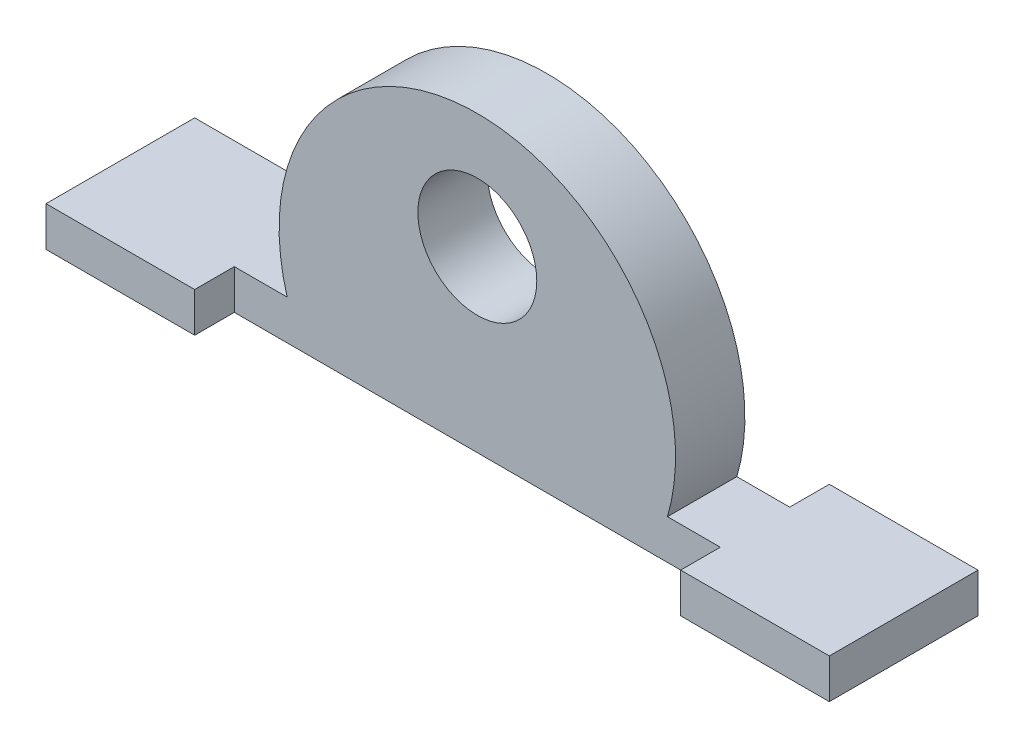
ISO-10303-21;
HEADER;
FILE_DESCRIPTION(('STEP AP214'),'2;1');
FILE_NAME('part.step','',(''),(''),'','','');
FILE_SCHEMA(('AUTOMOTIVE_DESIGN { 1 0 10303 214 1 1 1 1 }'));
ENDSEC;
DATA;
#1=APPLICATION_CONTEXT('core data for automotive mechanical design processes');
#2=APPLICATION_PROTOCOL_DEFINITION('international standard','automotive_design',2000,#1);
#3=PRODUCT_CONTEXT('',#1,'mechanical');
#4=PRODUCT('Part','Part','',(#3));
#5=PRODUCT_RELATED_PRODUCT_CATEGORY('part','',(#4));
#6=PRODUCT_DEFINITION_FORMATION('','',#4);
#7=PRODUCT_DEFINITION_CONTEXT('part definition',#1,'design');
#8=PRODUCT_DEFINITION('design','',#6,#7);
#9=PRODUCT_DEFINITION_SHAPE('','',#8);
#10=(LENGTH_UNIT() NAMED_UNIT(*) SI_UNIT(.MILLI.,.METRE.));
#11=(NAMED_UNIT(*) PLANE_ANGLE_UNIT() SI_UNIT($,.RADIAN.));
#12=(NAMED_UNIT(*) SI_UNIT($,.STERADIAN.) SOLID_ANGLE_UNIT());
#13=UNCERTAINTY_MEASURE_WITH_UNIT(LENGTH_MEASURE(1.E-05),#10,'distance_accuracy_value','');
#14=(GEOMETRIC_REPRESENTATION_CONTEXT(3) GLOBAL_UNCERTAINTY_ASSIGNED_CONTEXT((#13)) GLOBAL_UNIT_ASSIGNED_CONTEXT((#10,
#11,#12)) REPRESENTATION_CONTEXT('',''));
#15=CARTESIAN_POINT('',(0.,0.,0.));
#16=DIRECTION('',(0.,0.,1.));
#17=DIRECTION('',(1.,0.,0.));
#18=AXIS2_PLACEMENT_3D('',#15,#16,#17);
#19=CARTESIAN_POINT('',(0.,0.,7.));
#20=DIRECTION('',(0.,0.,1.));
#21=DIRECTION('',(1.,0.,0.));
#22=AXIS2_PLACEMENT_3D('',#19,#20,#21);
#23=PLANE('',#22);
#24=DIRECTION('',(1.,0.,0.));
#25=VECTOR('',#24,1.);
#26=CARTESIAN_POINT('',(17.5178370985048,-9.65014939730209,7.));
#27=LINE('',#26,#25);
#28=CARTESIAN_POINT('',(-24.5178370985048,-9.65014939730209,7.));
#29=VERTEX_POINT('',#28);
#30=CARTESIAN_POINT('',(24.5178370985048,-9.65014939730209,7.));
#31=VERTEX_POINT('',#30);
#32=EDGE_CURVE('E253',#29,#31,#27,.T.);
#33=ORIENTED_EDGE('',*,*,#32,.T.);
#34=DIRECTION('',(0.,-1.,0.));
#35=VECTOR('',#34,1.);
#36=CARTESIAN_POINT('',(24.5178370985048,-5.65014939730209,7.));
#37=LINE('',#36,#35);
#38=CARTESIAN_POINT('',(24.5178370985048,-5.65014939730209,7.));
#39=VERTEX_POINT('',#38);
#40=EDGE_CURVE('E208',#39,#31,#37,.T.);
#41=ORIENTED_EDGE('',*,*,#40,.F.);
#42=DIRECTION('',(-1.,0.,0.));
#43=VECTOR('',#42,1.);
#44=CARTESIAN_POINT('',(17.5178370985048,-5.65014939730209,7.));
#45=LINE('',#44,#43);
#46=CARTESIAN_POINT('',(19.1853019728168,-5.65014939730209,7.));
#47=VERTEX_POINT('',#46);
#48=EDGE_CURVE('E230',#39,#47,#45,.T.);
#49=ORIENTED_EDGE('',*,*,#48,.T.);
#50=CARTESIAN_POINT('',(0.,0.,7.));
#51=DIRECTION('',(0.,0.,1.));
#52=DIRECTION('',(1.,0.,0.));
#53=AXIS2_PLACEMENT_3D('',#50,#51,#52);
#54=CIRCLE('',#53,20.);
#55=CARTESIAN_POINT('',(-19.1853019728168,-5.65014939730209,7.));
#56=VERTEX_POINT('',#55);
#57=EDGE_CURVE('E53',#47,#56,#54,.T.);
#58=ORIENTED_EDGE('',*,*,#57,.T.);
#59=DIRECTION('',(-1.,0.,0.));
#60=VECTOR('',#59,1.);
#61=CARTESIAN_POINT('',(-17.5178370985048,-5.65014939730209,7.));
#62=LINE('',#61,#60);
#63=CARTESIAN_POINT('',(-24.5178370985048,-5.65014939730209,7.));
#64=VERTEX_POINT('',#63);
#65=EDGE_CURVE('E137',#56,#64,#62,.T.);
#66=ORIENTED_EDGE('',*,*,#65,.T.);
#67=DIRECTION('',(0.,-1.,0.));
#68=VECTOR('',#67,1.);
#69=CARTESIAN_POINT('',(-24.5178370985048,-5.65014939730209,7.));
#70=LINE('',#69,#68);
#71=EDGE_CURVE('E140',#64,#29,#70,.T.);
#72=ORIENTED_EDGE('',*,*,#71,.T.);
#73=EDGE_LOOP('',(#33,#41,#49,#58,#66,#72));
#74=FACE_BOUND('',#73,.T.);
#75=CARTESIAN_POINT('',(0.,8.34985060269791,7.));
#76=DIRECTION('',(0.,0.,1.));
#77=DIRECTION('',(1.,0.,0.));
#78=AXIS2_PLACEMENT_3D('',#75,#76,#77);
#79=CIRCLE('',#78,6.);
#80=CARTESIAN_POINT('',(6.,8.34985060269791,7.));
#81=VERTEX_POINT('',#80);
#82=EDGE_CURVE('E246',#81,#81,#79,.T.);
#83=ORIENTED_EDGE('',*,*,#82,.F.);
#84=EDGE_LOOP('',(#83));
#85=FACE_BOUND('',#84,.T.);
#86=ADVANCED_FACE('F39',(#74,#85),#23,.T.);
#87=CARTESIAN_POINT('',(0.,0.,0.));
#88=DIRECTION('',(0.,0.,1.));
#89=DIRECTION('',(1.,0.,0.));
#90=AXIS2_PLACEMENT_3D('',#87,#88,#89);
#91=PLANE('',#90);
#92=DIRECTION('',(0.,-1.,0.));
#93=VECTOR('',#92,1.);
#94=CARTESIAN_POINT('',(24.5178370985048,-5.65014939730209,0.));
#95=LINE('',#94,#93);
#96=CARTESIAN_POINT('',(24.5178370985048,-5.65014939730209,0.));
#97=VERTEX_POINT('',#96);
#98=CARTESIAN_POINT('',(24.5178370985048,-9.65014939730209,0.));
#99=VERTEX_POINT('',#98);
#100=EDGE_CURVE('E211',#97,#99,#95,.T.);
#101=ORIENTED_EDGE('',*,*,#100,.T.);
#102=DIRECTION('',(1.,0.,0.));
#103=VECTOR('',#102,1.);
#104=CARTESIAN_POINT('',(17.5178370985048,-9.65014939730209,0.));
#105=LINE('',#104,#103);
#106=CARTESIAN_POINT('',(-24.5178370985048,-9.65014939730209,0.));
#107=VERTEX_POINT('',#106);
#108=EDGE_CURVE('E254',#107,#99,#105,.T.);
#109=ORIENTED_EDGE('',*,*,#108,.F.);
#110=DIRECTION('',(0.,-1.,0.));
#111=VECTOR('',#110,1.);
#112=CARTESIAN_POINT('',(-24.5178370985048,-5.65014939730209,0.));
#113=LINE('',#112,#111);
#114=CARTESIAN_POINT('',(-24.5178370985048,-5.65014939730209,0.));
#115=VERTEX_POINT('',#114);
#116=EDGE_CURVE('E188',#115,#107,#113,.T.);
#117=ORIENTED_EDGE('',*,*,#116,.F.);
#118=DIRECTION('',(1.,0.,0.));
#119=VECTOR('',#118,1.);
#120=CARTESIAN_POINT('',(-17.5178370985048,-5.65014939730209,0.));
#121=LINE('',#120,#119);
#122=CARTESIAN_POINT('',(-19.1853019728168,-5.65014939730209,0.));
#123=VERTEX_POINT('',#122);
#124=EDGE_CURVE('E154',#115,#123,#121,.T.);
#125=ORIENTED_EDGE('',*,*,#124,.T.);
#126=CARTESIAN_POINT('',(0.,0.,0.));
#127=DIRECTION('',(0.,0.,1.));
#128=DIRECTION('',(1.,0.,0.));
#129=AXIS2_PLACEMENT_3D('',#126,#127,#128);
#130=CIRCLE('',#129,20.);
#131=CARTESIAN_POINT('',(19.1853019728168,-5.65014939730209,0.));
#132=VERTEX_POINT('',#131);
#133=EDGE_CURVE('E249',#132,#123,#130,.T.);
#134=ORIENTED_EDGE('',*,*,#133,.F.);
#135=DIRECTION('',(1.,0.,0.));
#136=VECTOR('',#135,1.);
#137=CARTESIAN_POINT('',(17.5178370985048,-5.65014939730209,0.));
#138=LINE('',#137,#136);
#139=EDGE_CURVE('E201',#132,#97,#138,.T.);
#140=ORIENTED_EDGE('',*,*,#139,.T.);
#141=EDGE_LOOP('',(#101,#109,#117,#125,#134,#140));
#142=FACE_BOUND('',#141,.T.);
#143=CARTESIAN_POINT('',(0.,8.34985060269791,0.));
#144=DIRECTION('',(0.,0.,1.));
#145=DIRECTION('',(1.,0.,0.));
#146=AXIS2_PLACEMENT_3D('',#143,#144,#145);
#147=CIRCLE('',#146,6.);
#148=CARTESIAN_POINT('',(6.,8.34985060269791,0.));
#149=VERTEX_POINT('',#148);
#150=EDGE_CURVE('E191',#149,#149,#147,.T.);
#151=ORIENTED_EDGE('',*,*,#150,.T.);
#152=EDGE_LOOP('',(#151));
#153=FACE_BOUND('',#152,.T.);
#154=ADVANCED_FACE('F263',(#142,#153),#91,.F.);
#155=CARTESIAN_POINT('',(0.,0.,7.));
#156=DIRECTION('',(0.,0.,-1.));
#157=DIRECTION('',(-1.,0.,0.));
#158=AXIS2_PLACEMENT_3D('',#155,#156,#157);
#159=CYLINDRICAL_SURFACE('',#158,20.);
#160=ORIENTED_EDGE('',*,*,#133,.T.);
#161=DIRECTION('',(0.,0.,-1.));
#162=VECTOR('',#161,1.);
#163=CARTESIAN_POINT('',(-19.1853019728168,-5.65014939730209,7.));
#164=LINE('',#163,#162);
#165=EDGE_CURVE('E11',#123,#56,#164,.F.);
#166=ORIENTED_EDGE('',*,*,#165,.T.);
#167=ORIENTED_EDGE('',*,*,#57,.F.);
#168=DIRECTION('',(0.,0.,-1.));
#169=VECTOR('',#168,1.);
#170=CARTESIAN_POINT('',(19.1853019728168,-5.65014939730209,7.));
#171=LINE('',#170,#169);
#172=EDGE_CURVE('E47',#47,#132,#171,.T.);
#173=ORIENTED_EDGE('',*,*,#172,.T.);
#174=EDGE_LOOP('',(#160,#166,#167,#173));
#175=FACE_BOUND('',#174,.T.);
#176=ADVANCED_FACE('F41',(#175),#159,.T.);
#177=CARTESIAN_POINT('',(17.5178370985048,-9.65014939730209,7.));
#178=DIRECTION('',(0.,1.,0.));
#179=DIRECTION('',(0.,0.,1.));
#180=AXIS2_PLACEMENT_3D('',#177,#178,#179);
#181=PLANE('',#180);
#182=ORIENTED_EDGE('',*,*,#108,.T.);
#183=DIRECTION('',(0.,0.,-1.));
#184=VECTOR('',#183,1.);
#185=CARTESIAN_POINT('',(24.5178370985048,-9.65014939730209,-4.));
#186=LINE('',#185,#184);
#187=CARTESIAN_POINT('',(24.5178370985048,-9.65014939730209,-4.));
#188=VERTEX_POINT('',#187);
#189=EDGE_CURVE('E177',#99,#188,#186,.T.);
#190=ORIENTED_EDGE('',*,*,#189,.T.);
#191=DIRECTION('',(1.,0.,0.));
#192=VECTOR('',#191,1.);
#193=CARTESIAN_POINT('',(24.5178370985048,-9.65014939730209,-4.));
#194=LINE('',#193,#192);
#195=CARTESIAN_POINT('',(39.5178370985048,-9.65014939730209,-4.));
#196=VERTEX_POINT('',#195);
#197=EDGE_CURVE('E224',#188,#196,#194,.T.);
#198=ORIENTED_EDGE('',*,*,#197,.T.);
#199=DIRECTION('',(0.,0.,1.));
#200=VECTOR('',#199,1.);
#201=CARTESIAN_POINT('',(39.5178370985048,-9.65014939730209,11.));
#202=LINE('',#201,#200);
#203=CARTESIAN_POINT('',(39.5178370985048,-9.65014939730209,11.));
#204=VERTEX_POINT('',#203);
#205=EDGE_CURVE('E221',#196,#204,#202,.T.);
#206=ORIENTED_EDGE('',*,*,#205,.T.);
#207=DIRECTION('',(-1.,0.,0.));
#208=VECTOR('',#207,1.);
#209=CARTESIAN_POINT('',(24.5178370985048,-9.65014939730209,11.));
#210=LINE('',#209,#208);
#211=CARTESIAN_POINT('',(24.5178370985048,-9.65014939730209,11.));
#212=VERTEX_POINT('',#211);
#213=EDGE_CURVE('E217',#204,#212,#210,.T.);
#214=ORIENTED_EDGE('',*,*,#213,.T.);
#215=DIRECTION('',(0.,0.,-1.));
#216=VECTOR('',#215,1.);
#217=CARTESIAN_POINT('',(24.5178370985048,-9.65014939730209,7.));
#218=LINE('',#217,#216);
#219=EDGE_CURVE('E214',#212,#31,#218,.T.);
#220=ORIENTED_EDGE('',*,*,#219,.T.);
#221=ORIENTED_EDGE('',*,*,#32,.F.);
#222=DIRECTION('',(0.,0.,1.));
#223=VECTOR('',#222,1.);
#224=CARTESIAN_POINT('',(-24.5178370985048,-9.65014939730209,7.));
#225=LINE('',#224,#223);
#226=CARTESIAN_POINT('',(-24.5178370985048,-9.65014939730209,11.));
#227=VERTEX_POINT('',#226);
#228=EDGE_CURVE('E152',#29,#227,#225,.T.);
#229=ORIENTED_EDGE('',*,*,#228,.T.);
#230=DIRECTION('',(-1.,0.,0.));
#231=VECTOR('',#230,1.);
#232=CARTESIAN_POINT('',(-24.5178370985048,-9.65014939730209,11.));
#233=LINE('',#232,#231);
#234=CARTESIAN_POINT('',(-39.5178370985048,-9.65014939730209,11.));
#235=VERTEX_POINT('',#234);
#236=EDGE_CURVE('E176',#227,#235,#233,.T.);
#237=ORIENTED_EDGE('',*,*,#236,.T.);
#238=DIRECTION('',(0.,0.,-1.));
#239=VECTOR('',#238,1.);
#240=CARTESIAN_POINT('',(-39.5178370985048,-9.65014939730209,11.));
#241=LINE('',#240,#239);
#242=CARTESIAN_POINT('',(-39.5178370985048,-9.65014939730209,-4.));
#243=VERTEX_POINT('',#242);
#244=EDGE_CURVE('E180',#235,#243,#241,.T.);
#245=ORIENTED_EDGE('',*,*,#244,.T.);
#246=DIRECTION('',(1.,0.,0.));
#247=VECTOR('',#246,1.);
#248=CARTESIAN_POINT('',(-24.5178370985048,-9.65014939730209,-4.));
#249=LINE('',#248,#247);
#250=CARTESIAN_POINT('',(-24.5178370985048,-9.65014939730209,-4.));
#251=VERTEX_POINT('',#250);
#252=EDGE_CURVE('E183',#243,#251,#249,.T.);
#253=ORIENTED_EDGE('',*,*,#252,.T.);
#254=DIRECTION('',(0.,0.,1.));
#255=VECTOR('',#254,1.);
#256=CARTESIAN_POINT('',(-24.5178370985048,-9.65014939730209,-4.));
#257=LINE('',#256,#255);
#258=EDGE_CURVE('E146',#251,#107,#257,.T.);
#259=ORIENTED_EDGE('',*,*,#258,.T.);
#260=EDGE_LOOP('',(#182,#190,#198,#206,#214,#220,#221,#229,#237,#245,#253,#259));
#261=FACE_BOUND('',#260,.T.);
#262=ADVANCED_FACE('F258',(#261),#181,.F.);
#263=CARTESIAN_POINT('',(0.,8.34985060269791,7.));
#264=DIRECTION('',(0.,0.,-1.));
#265=DIRECTION('',(-1.,0.,0.));
#266=AXIS2_PLACEMENT_3D('',#263,#264,#265);
#267=CYLINDRICAL_SURFACE('',#266,6.);
#268=ORIENTED_EDGE('',*,*,#82,.T.);
#269=EDGE_LOOP('',(#268));
#270=FACE_BOUND('',#269,.T.);
#271=ORIENTED_EDGE('',*,*,#150,.F.);
#272=EDGE_LOOP('',(#271));
#273=FACE_BOUND('',#272,.T.);
#274=ADVANCED_FACE('F289',(#270,#273),#267,.F.);
#275=CARTESIAN_POINT('',(0.,-5.65014939730209,0.));
#276=DIRECTION('',(0.,1.,0.));
#277=DIRECTION('',(0.,0.,1.));
#278=AXIS2_PLACEMENT_3D('',#275,#276,#277);
#279=PLANE('',#278);
#280=ORIENTED_EDGE('',*,*,#172,.F.);
#281=ORIENTED_EDGE('',*,*,#48,.F.);
#282=DIRECTION('',(0.,0.,-1.));
#283=VECTOR('',#282,1.);
#284=CARTESIAN_POINT('',(24.5178370985048,-5.65014939730209,7.));
#285=LINE('',#284,#283);
#286=CARTESIAN_POINT('',(24.5178370985048,-5.65014939730209,11.));
#287=VERTEX_POINT('',#286);
#288=EDGE_CURVE('E232',#287,#39,#285,.T.);
#289=ORIENTED_EDGE('',*,*,#288,.F.);
#290=DIRECTION('',(-1.,0.,0.));
#291=VECTOR('',#290,1.);
#292=CARTESIAN_POINT('',(24.5178370985048,-5.65014939730209,11.));
#293=LINE('',#292,#291);
#294=CARTESIAN_POINT('',(39.5178370985048,-5.65014939730209,11.));
#295=VERTEX_POINT('',#294);
#296=EDGE_CURVE('E235',#295,#287,#293,.T.);
#297=ORIENTED_EDGE('',*,*,#296,.F.);
#298=DIRECTION('',(0.,0.,1.));
#299=VECTOR('',#298,1.);
#300=CARTESIAN_POINT('',(39.5178370985048,-5.65014939730209,11.));
#301=LINE('',#300,#299);
#302=CARTESIAN_POINT('',(39.5178370985048,-5.65014939730209,-4.));
#303=VERTEX_POINT('',#302);
#304=EDGE_CURVE('E238',#303,#295,#301,.T.);
#305=ORIENTED_EDGE('',*,*,#304,.F.);
#306=DIRECTION('',(1.,0.,0.));
#307=VECTOR('',#306,1.);
#308=CARTESIAN_POINT('',(24.5178370985048,-5.65014939730209,-4.));
#309=LINE('',#308,#307);
#310=CARTESIAN_POINT('',(24.5178370985048,-5.65014939730209,-4.));
#311=VERTEX_POINT('',#310);
#312=EDGE_CURVE('E241',#311,#303,#309,.T.);
#313=ORIENTED_EDGE('',*,*,#312,.F.);
#314=DIRECTION('',(0.,0.,-1.));
#315=VECTOR('',#314,1.);
#316=CARTESIAN_POINT('',(24.5178370985048,-5.65014939730209,-4.));
#317=LINE('',#316,#315);
#318=EDGE_CURVE('E218',#97,#311,#317,.T.);
#319=ORIENTED_EDGE('',*,*,#318,.F.);
#320=ORIENTED_EDGE('',*,*,#139,.F.);
#321=EDGE_LOOP('',(#280,#281,#289,#297,#305,#313,#319,#320));
#322=FACE_BOUND('',#321,.T.);
#323=ADVANCED_FACE('F287',(#322),#279,.T.);
#324=CARTESIAN_POINT('',(24.5178370985048,-5.65014939730209,-4.));
#325=DIRECTION('',(-1.,0.,0.));
#326=DIRECTION('',(0.,0.,1.));
#327=AXIS2_PLACEMENT_3D('',#324,#325,#326);
#328=PLANE('',#327);
#329=ORIENTED_EDGE('',*,*,#189,.F.);
#330=ORIENTED_EDGE('',*,*,#100,.F.);
#331=ORIENTED_EDGE('',*,*,#318,.T.);
#332=DIRECTION('',(0.,-1.,0.));
#333=VECTOR('',#332,1.);
#334=CARTESIAN_POINT('',(24.5178370985048,-5.65014939730209,-4.));
#335=LINE('',#334,#333);
#336=EDGE_CURVE('E199',#311,#188,#335,.T.);
#337=ORIENTED_EDGE('',*,*,#336,.T.);
#338=EDGE_LOOP('',(#329,#330,#331,#337));
#339=FACE_BOUND('',#338,.T.);
#340=ADVANCED_FACE('F268',(#339),#328,.T.);
#341=CARTESIAN_POINT('',(24.5178370985048,-5.65014939730209,7.));
#342=DIRECTION('',(-1.,0.,0.));
#343=DIRECTION('',(0.,0.,1.));
#344=AXIS2_PLACEMENT_3D('',#341,#342,#343);
#345=PLANE('',#344);
#346=ORIENTED_EDGE('',*,*,#219,.F.);
#347=DIRECTION('',(0.,-1.,0.));
#348=VECTOR('',#347,1.);
#349=CARTESIAN_POINT('',(24.5178370985048,-5.65014939730209,11.));
#350=LINE('',#349,#348);
#351=EDGE_CURVE('E206',#287,#212,#350,.T.);
#352=ORIENTED_EDGE('',*,*,#351,.F.);
#353=ORIENTED_EDGE('',*,*,#288,.T.);
#354=ORIENTED_EDGE('',*,*,#40,.T.);
#355=EDGE_LOOP('',(#346,#352,#353,#354));
#356=FACE_BOUND('',#355,.T.);
#357=ADVANCED_FACE('F284',(#356),#345,.T.);
#358=CARTESIAN_POINT('',(24.5178370985048,-5.65014939730209,11.));
#359=DIRECTION('',(0.,0.,1.));
#360=DIRECTION('',(1.,0.,0.));
#361=AXIS2_PLACEMENT_3D('',#358,#359,#360);
#362=PLANE('',#361);
#363=ORIENTED_EDGE('',*,*,#213,.F.);
#364=DIRECTION('',(0.,-1.,0.));
#365=VECTOR('',#364,1.);
#366=CARTESIAN_POINT('',(39.5178370985048,-5.65014939730209,11.));
#367=LINE('',#366,#365);
#368=EDGE_CURVE('E204',#295,#204,#367,.T.);
#369=ORIENTED_EDGE('',*,*,#368,.F.);
#370=ORIENTED_EDGE('',*,*,#296,.T.);
#371=ORIENTED_EDGE('',*,*,#351,.T.);
#372=EDGE_LOOP('',(#363,#369,#370,#371));
#373=FACE_BOUND('',#372,.T.);
#374=ADVANCED_FACE('F280',(#373),#362,.T.);
#375=CARTESIAN_POINT('',(39.5178370985048,-5.65014939730209,11.));
#376=DIRECTION('',(1.,0.,0.));
#377=DIRECTION('',(0.,0.,-1.));
#378=AXIS2_PLACEMENT_3D('',#375,#376,#377);
#379=PLANE('',#378);
#380=ORIENTED_EDGE('',*,*,#205,.F.);
#381=DIRECTION('',(0.,-1.,0.));
#382=VECTOR('',#381,1.);
#383=CARTESIAN_POINT('',(39.5178370985048,-5.65014939730209,-4.));
#384=LINE('',#383,#382);
#385=EDGE_CURVE('E202',#303,#196,#384,.T.);
#386=ORIENTED_EDGE('',*,*,#385,.F.);
#387=ORIENTED_EDGE('',*,*,#304,.T.);
#388=ORIENTED_EDGE('',*,*,#368,.T.);
#389=EDGE_LOOP('',(#380,#386,#387,#388));
#390=FACE_BOUND('',#389,.T.);
#391=ADVANCED_FACE('F276',(#390),#379,.T.);
#392=CARTESIAN_POINT('',(24.5178370985048,-5.65014939730209,-4.));
#393=DIRECTION('',(0.,0.,-1.));
#394=DIRECTION('',(-1.,0.,0.));
#395=AXIS2_PLACEMENT_3D('',#392,#393,#394);
#396=PLANE('',#395);
#397=ORIENTED_EDGE('',*,*,#197,.F.);
#398=ORIENTED_EDGE('',*,*,#336,.F.);
#399=ORIENTED_EDGE('',*,*,#312,.T.);
#400=ORIENTED_EDGE('',*,*,#385,.T.);
#401=EDGE_LOOP('',(#397,#398,#399,#400));
#402=FACE_BOUND('',#401,.T.);
#403=ADVANCED_FACE('F272',(#402),#396,.T.);
#404=CARTESIAN_POINT('',(0.,-5.65014939730209,0.));
#405=DIRECTION('',(0.,1.,0.));
#406=DIRECTION('',(0.,0.,1.));
#407=AXIS2_PLACEMENT_3D('',#404,#405,#406);
#408=PLANE('',#407);
#409=ORIENTED_EDGE('',*,*,#165,.F.);
#410=ORIENTED_EDGE('',*,*,#124,.F.);
#411=DIRECTION('',(0.,0.,1.));
#412=VECTOR('',#411,1.);
#413=CARTESIAN_POINT('',(-24.5178370985048,-5.65014939730209,-4.));
#414=LINE('',#413,#412);
#415=CARTESIAN_POINT('',(-24.5178370985048,-5.65014939730209,-4.));
#416=VERTEX_POINT('',#415);
#417=EDGE_CURVE('E170',#416,#115,#414,.T.);
#418=ORIENTED_EDGE('',*,*,#417,.F.);
#419=DIRECTION('',(1.,0.,0.));
#420=VECTOR('',#419,1.);
#421=CARTESIAN_POINT('',(-24.5178370985048,-5.65014939730209,-4.));
#422=LINE('',#421,#420);
#423=CARTESIAN_POINT('',(-39.5178370985048,-5.65014939730209,-4.));
#424=VERTEX_POINT('',#423);
#425=EDGE_CURVE('E167',#424,#416,#422,.T.);
#426=ORIENTED_EDGE('',*,*,#425,.F.);
#427=DIRECTION('',(0.,0.,-1.));
#428=VECTOR('',#427,1.);
#429=CARTESIAN_POINT('',(-39.5178370985048,-5.65014939730209,11.));
#430=LINE('',#429,#428);
#431=CARTESIAN_POINT('',(-39.5178370985048,-5.65014939730209,11.));
#432=VERTEX_POINT('',#431);
#433=EDGE_CURVE('E162',#432,#424,#430,.T.);
#434=ORIENTED_EDGE('',*,*,#433,.F.);
#435=DIRECTION('',(-1.,0.,0.));
#436=VECTOR('',#435,1.);
#437=CARTESIAN_POINT('',(-24.5178370985048,-5.65014939730209,11.));
#438=LINE('',#437,#436);
#439=CARTESIAN_POINT('',(-24.5178370985048,-5.65014939730209,11.));
#440=VERTEX_POINT('',#439);
#441=EDGE_CURVE('E160',#440,#432,#438,.T.);
#442=ORIENTED_EDGE('',*,*,#441,.F.);
#443=DIRECTION('',(0.,0.,1.));
#444=VECTOR('',#443,1.);
#445=CARTESIAN_POINT('',(-24.5178370985048,-5.65014939730209,7.));
#446=LINE('',#445,#444);
#447=EDGE_CURVE('E145',#64,#440,#446,.T.);
#448=ORIENTED_EDGE('',*,*,#447,.F.);
#449=ORIENTED_EDGE('',*,*,#65,.F.);
#450=EDGE_LOOP('',(#409,#410,#418,#426,#434,#442,#448,#449));
#451=FACE_BOUND('',#450,.T.);
#452=ADVANCED_FACE('F157',(#451),#408,.T.);
#453=CARTESIAN_POINT('',(-24.5178370985048,-5.65014939730209,-4.));
#454=DIRECTION('',(1.,0.,0.));
#455=DIRECTION('',(0.,0.,-1.));
#456=AXIS2_PLACEMENT_3D('',#453,#454,#455);
#457=PLANE('',#456);
#458=ORIENTED_EDGE('',*,*,#258,.F.);
#459=DIRECTION('',(0.,-1.,0.));
#460=VECTOR('',#459,1.);
#461=CARTESIAN_POINT('',(-24.5178370985048,-5.65014939730209,-4.));
#462=LINE('',#461,#460);
#463=EDGE_CURVE('E192',#416,#251,#462,.T.);
#464=ORIENTED_EDGE('',*,*,#463,.F.);
#465=ORIENTED_EDGE('',*,*,#417,.T.);
#466=ORIENTED_EDGE('',*,*,#116,.T.);
#467=EDGE_LOOP('',(#458,#464,#465,#466));
#468=FACE_BOUND('',#467,.T.);
#469=ADVANCED_FACE('F366',(#468),#457,.T.);
#470=CARTESIAN_POINT('',(-24.5178370985048,-5.65014939730209,-4.));
#471=DIRECTION('',(0.,0.,-1.));
#472=DIRECTION('',(-1.,0.,0.));
#473=AXIS2_PLACEMENT_3D('',#470,#471,#472);
#474=PLANE('',#473);
#475=ORIENTED_EDGE('',*,*,#252,.F.);
#476=DIRECTION('',(0.,-1.,0.));
#477=VECTOR('',#476,1.);
#478=CARTESIAN_POINT('',(-39.5178370985048,-5.65014939730209,-4.));
#479=LINE('',#478,#477);
#480=EDGE_CURVE('E194',#424,#243,#479,.T.);
#481=ORIENTED_EDGE('',*,*,#480,.F.);
#482=ORIENTED_EDGE('',*,*,#425,.T.);
#483=ORIENTED_EDGE('',*,*,#463,.T.);
#484=EDGE_LOOP('',(#475,#481,#482,#483));
#485=FACE_BOUND('',#484,.T.);
#486=ADVANCED_FACE('F317',(#485),#474,.T.);
#487=CARTESIAN_POINT('',(-39.5178370985048,-5.65014939730209,11.));
#488=DIRECTION('',(-1.,0.,0.));
#489=DIRECTION('',(0.,0.,1.));
#490=AXIS2_PLACEMENT_3D('',#487,#488,#489);
#491=PLANE('',#490);
#492=ORIENTED_EDGE('',*,*,#244,.F.);
#493=DIRECTION('',(0.,-1.,0.));
#494=VECTOR('',#493,1.);
#495=CARTESIAN_POINT('',(-39.5178370985048,-5.65014939730209,11.));
#496=LINE('',#495,#494);
#497=EDGE_CURVE('E196',#432,#235,#496,.T.);
#498=ORIENTED_EDGE('',*,*,#497,.F.);
#499=ORIENTED_EDGE('',*,*,#433,.T.);
#500=ORIENTED_EDGE('',*,*,#480,.T.);
#501=EDGE_LOOP('',(#492,#498,#499,#500));
#502=FACE_BOUND('',#501,.T.);
#503=ADVANCED_FACE('F320',(#502),#491,.T.);
#504=CARTESIAN_POINT('',(-24.5178370985048,-5.65014939730209,11.));
#505=DIRECTION('',(0.,0.,1.));
#506=DIRECTION('',(1.,0.,0.));
#507=AXIS2_PLACEMENT_3D('',#504,#505,#506);
#508=PLANE('',#507);
#509=ORIENTED_EDGE('',*,*,#236,.F.);
#510=DIRECTION('',(0.,-1.,0.));
#511=VECTOR('',#510,1.);
#512=CARTESIAN_POINT('',(-24.5178370985048,-5.65014939730209,11.));
#513=LINE('',#512,#511);
#514=EDGE_CURVE('E153',#440,#227,#513,.T.);
#515=ORIENTED_EDGE('',*,*,#514,.F.);
#516=ORIENTED_EDGE('',*,*,#441,.T.);
#517=ORIENTED_EDGE('',*,*,#497,.T.);
#518=EDGE_LOOP('',(#509,#515,#516,#517));
#519=FACE_BOUND('',#518,.T.);
#520=ADVANCED_FACE('F323',(#519),#508,.T.);
#521=CARTESIAN_POINT('',(-24.5178370985048,-5.65014939730209,7.));
#522=DIRECTION('',(1.,0.,0.));
#523=DIRECTION('',(0.,0.,-1.));
#524=AXIS2_PLACEMENT_3D('',#521,#522,#523);
#525=PLANE('',#524);
#526=ORIENTED_EDGE('',*,*,#228,.F.);
#527=ORIENTED_EDGE('',*,*,#71,.F.);
#528=ORIENTED_EDGE('',*,*,#447,.T.);
#529=ORIENTED_EDGE('',*,*,#514,.T.);
#530=EDGE_LOOP('',(#526,#527,#528,#529));
#531=FACE_BOUND('',#530,.T.);
#532=ADVANCED_FACE('F150',(#531),#525,.T.);
#533=CLOSED_SHELL('',(#86,#154,#176,#262,#274,#323,#340,#357,#374,#391,#403,#452,#469,#486,#503,
#520,#532));
#534=MANIFOLD_SOLID_BREP('B2',#533);
#535=ADVANCED_BREP_SHAPE_REPRESENTATION('',(#18,#534),#14);
#536=SHAPE_DEFINITION_REPRESENTATION(#9,#535);
ENDSEC;
END-ISO-10303-21;
